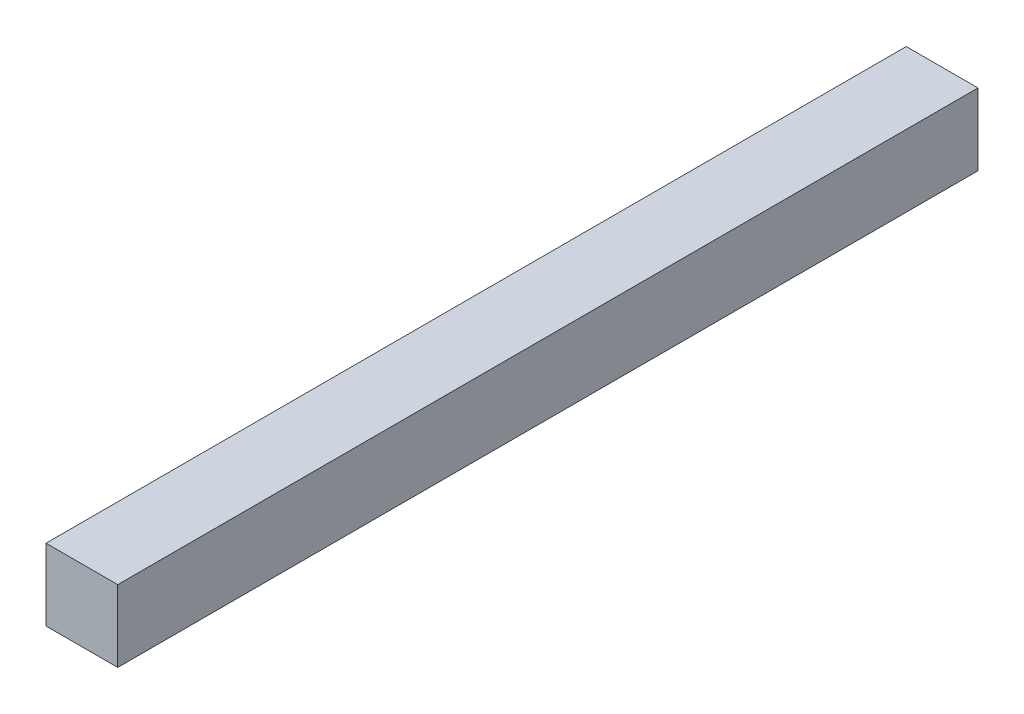
ISO-10303-21;
HEADER;
FILE_DESCRIPTION(('STEP AP214'),'2;1');
FILE_NAME('part.step','',(''),(''),'','','');
FILE_SCHEMA(('AUTOMOTIVE_DESIGN { 1 0 10303 214 1 1 1 1 }'));
ENDSEC;
DATA;
#1=APPLICATION_CONTEXT('core data for automotive mechanical design processes');
#2=APPLICATION_PROTOCOL_DEFINITION('international standard','automotive_design',2000,#1);
#3=PRODUCT_CONTEXT('',#1,'mechanical');
#4=PRODUCT('Part','Part','',(#3));
#5=PRODUCT_RELATED_PRODUCT_CATEGORY('part','',(#4));
#6=PRODUCT_DEFINITION_FORMATION('','',#4);
#7=PRODUCT_DEFINITION_CONTEXT('part definition',#1,'design');
#8=PRODUCT_DEFINITION('design','',#6,#7);
#9=PRODUCT_DEFINITION_SHAPE('','',#8);
#10=(LENGTH_UNIT() NAMED_UNIT(*) SI_UNIT(.MILLI.,.METRE.));
#11=(NAMED_UNIT(*) PLANE_ANGLE_UNIT() SI_UNIT($,.RADIAN.));
#12=(NAMED_UNIT(*) SI_UNIT($,.STERADIAN.) SOLID_ANGLE_UNIT());
#13=UNCERTAINTY_MEASURE_WITH_UNIT(LENGTH_MEASURE(1.E-05),#10,'distance_accuracy_value','');
#14=(GEOMETRIC_REPRESENTATION_CONTEXT(3) GLOBAL_UNCERTAINTY_ASSIGNED_CONTEXT((#13)) GLOBAL_UNIT_ASSIGNED_CONTEXT((#10,
#11,#12)) REPRESENTATION_CONTEXT('',''));
#15=CARTESIAN_POINT('',(0.,0.,0.));
#16=DIRECTION('',(0.,0.,1.));
#17=DIRECTION('',(1.,0.,0.));
#18=AXIS2_PLACEMENT_3D('',#15,#16,#17);
#19=CARTESIAN_POINT('',(0.,0.,38.0746));
#20=DIRECTION('',(1.,0.,0.));
#21=DIRECTION('',(0.,0.,-1.));
#22=AXIS2_PLACEMENT_3D('',#19,#20,#21);
#23=PLANE('',#22);
#24=DIRECTION('',(0.,-1.,0.));
#25=VECTOR('',#24,1.);
#26=CARTESIAN_POINT('',(0.,0.,0.));
#27=LINE('',#26,#25);
#28=CARTESIAN_POINT('',(0.,3.175,0.));
#29=VERTEX_POINT('',#28);
#30=CARTESIAN_POINT('',(0.,0.,0.));
#31=VERTEX_POINT('',#30);
#32=EDGE_CURVE('E95',#29,#31,#27,.T.);
#33=ORIENTED_EDGE('',*,*,#32,.T.);
#34=DIRECTION('',(0.,0.,-1.));
#35=VECTOR('',#34,1.);
#36=CARTESIAN_POINT('',(0.,0.,38.0746));
#37=LINE('',#36,#35);
#38=CARTESIAN_POINT('',(0.,0.,38.0746));
#39=VERTEX_POINT('',#38);
#40=EDGE_CURVE('E11',#39,#31,#37,.T.);
#41=ORIENTED_EDGE('',*,*,#40,.F.);
#42=DIRECTION('',(0.,-1.,0.));
#43=VECTOR('',#42,1.);
#44=CARTESIAN_POINT('',(0.,0.,38.0746));
#45=LINE('',#44,#43);
#46=CARTESIAN_POINT('',(0.,3.175,38.0746));
#47=VERTEX_POINT('',#46);
#48=EDGE_CURVE('E83',#47,#39,#45,.T.);
#49=ORIENTED_EDGE('',*,*,#48,.F.);
#50=DIRECTION('',(0.,0.,-1.));
#51=VECTOR('',#50,1.);
#52=CARTESIAN_POINT('',(0.,3.175,38.0746));
#53=LINE('',#52,#51);
#54=EDGE_CURVE('E91',#47,#29,#53,.T.);
#55=ORIENTED_EDGE('',*,*,#54,.T.);
#56=EDGE_LOOP('',(#33,#41,#49,#55));
#57=FACE_BOUND('',#56,.T.);
#58=ADVANCED_FACE('F32',(#57),#23,.F.);
#59=CARTESIAN_POINT('',(0.,0.,38.0746));
#60=DIRECTION('',(0.,1.,0.));
#61=DIRECTION('',(0.,0.,1.));
#62=AXIS2_PLACEMENT_3D('',#59,#60,#61);
#63=PLANE('',#62);
#64=DIRECTION('',(1.,0.,0.));
#65=VECTOR('',#64,1.);
#66=CARTESIAN_POINT('',(0.,0.,0.));
#67=LINE('',#66,#65);
#68=CARTESIAN_POINT('',(3.175,0.,0.));
#69=VERTEX_POINT('',#68);
#70=EDGE_CURVE('E87',#31,#69,#67,.T.);
#71=ORIENTED_EDGE('',*,*,#70,.T.);
#72=DIRECTION('',(0.,0.,-1.));
#73=VECTOR('',#72,1.);
#74=CARTESIAN_POINT('',(3.175,0.,38.0746));
#75=LINE('',#74,#73);
#76=CARTESIAN_POINT('',(3.175,0.,38.0746));
#77=VERTEX_POINT('',#76);
#78=EDGE_CURVE('E40',#77,#69,#75,.T.);
#79=ORIENTED_EDGE('',*,*,#78,.F.);
#80=DIRECTION('',(1.,0.,0.));
#81=VECTOR('',#80,1.);
#82=CARTESIAN_POINT('',(0.,0.,38.0746));
#83=LINE('',#82,#81);
#84=EDGE_CURVE('E78',#39,#77,#83,.T.);
#85=ORIENTED_EDGE('',*,*,#84,.F.);
#86=ORIENTED_EDGE('',*,*,#40,.T.);
#87=EDGE_LOOP('',(#71,#79,#85,#86));
#88=FACE_BOUND('',#87,.T.);
#89=ADVANCED_FACE('F86',(#88),#63,.F.);
#90=CARTESIAN_POINT('',(3.175,0.,38.0746));
#91=DIRECTION('',(-1.,0.,0.));
#92=DIRECTION('',(0.,-1.,0.));
#93=AXIS2_PLACEMENT_3D('',#90,#91,#92);
#94=PLANE('',#93);
#95=DIRECTION('',(0.,1.,0.));
#96=VECTOR('',#95,1.);
#97=CARTESIAN_POINT('',(3.175,0.,0.));
#98=LINE('',#97,#96);
#99=CARTESIAN_POINT('',(3.175,3.175,0.));
#100=VERTEX_POINT('',#99);
#101=EDGE_CURVE('E65',#69,#100,#98,.T.);
#102=ORIENTED_EDGE('',*,*,#101,.T.);
#103=DIRECTION('',(0.,0.,-1.));
#104=VECTOR('',#103,1.);
#105=CARTESIAN_POINT('',(3.175,3.175,38.0746));
#106=LINE('',#105,#104);
#107=CARTESIAN_POINT('',(3.175,3.175,38.0746));
#108=VERTEX_POINT('',#107);
#109=EDGE_CURVE('E88',#108,#100,#106,.T.);
#110=ORIENTED_EDGE('',*,*,#109,.F.);
#111=DIRECTION('',(0.,1.,0.));
#112=VECTOR('',#111,1.);
#113=CARTESIAN_POINT('',(3.175,0.,38.0746));
#114=LINE('',#113,#112);
#115=EDGE_CURVE('E81',#77,#108,#114,.T.);
#116=ORIENTED_EDGE('',*,*,#115,.F.);
#117=ORIENTED_EDGE('',*,*,#78,.T.);
#118=EDGE_LOOP('',(#102,#110,#116,#117));
#119=FACE_BOUND('',#118,.T.);
#120=ADVANCED_FACE('F89',(#119),#94,.F.);
#121=CARTESIAN_POINT('',(0.,3.175,38.0746));
#122=DIRECTION('',(0.,-1.,0.));
#123=DIRECTION('',(0.,0.,-1.));
#124=AXIS2_PLACEMENT_3D('',#121,#122,#123);
#125=PLANE('',#124);
#126=DIRECTION('',(-1.,0.,0.));
#127=VECTOR('',#126,1.);
#128=CARTESIAN_POINT('',(0.,3.175,0.));
#129=LINE('',#128,#127);
#130=EDGE_CURVE('E71',#100,#29,#129,.T.);
#131=ORIENTED_EDGE('',*,*,#130,.T.);
#132=ORIENTED_EDGE('',*,*,#54,.F.);
#133=DIRECTION('',(-1.,0.,0.));
#134=VECTOR('',#133,1.);
#135=CARTESIAN_POINT('',(0.,3.175,38.0746));
#136=LINE('',#135,#134);
#137=EDGE_CURVE('E48',#108,#47,#136,.T.);
#138=ORIENTED_EDGE('',*,*,#137,.F.);
#139=ORIENTED_EDGE('',*,*,#109,.T.);
#140=EDGE_LOOP('',(#131,#132,#138,#139));
#141=FACE_BOUND('',#140,.T.);
#142=ADVANCED_FACE('F102',(#141),#125,.F.);
#143=CARTESIAN_POINT('',(0.,0.,38.0746));
#144=DIRECTION('',(0.,0.,-1.));
#145=DIRECTION('',(-1.,0.,0.));
#146=AXIS2_PLACEMENT_3D('',#143,#144,#145);
#147=PLANE('',#146);
#148=ORIENTED_EDGE('',*,*,#48,.T.);
#149=ORIENTED_EDGE('',*,*,#84,.T.);
#150=ORIENTED_EDGE('',*,*,#115,.T.);
#151=ORIENTED_EDGE('',*,*,#137,.T.);
#152=EDGE_LOOP('',(#148,#149,#150,#151));
#153=FACE_BOUND('',#152,.T.);
#154=ADVANCED_FACE('F79',(#153),#147,.F.);
#155=CARTESIAN_POINT('',(0.,0.,0.));
#156=DIRECTION('',(0.,0.,-1.));
#157=DIRECTION('',(-1.,0.,0.));
#158=AXIS2_PLACEMENT_3D('',#155,#156,#157);
#159=PLANE('',#158);
#160=ORIENTED_EDGE('',*,*,#32,.F.);
#161=ORIENTED_EDGE('',*,*,#130,.F.);
#162=ORIENTED_EDGE('',*,*,#101,.F.);
#163=ORIENTED_EDGE('',*,*,#70,.F.);
#164=EDGE_LOOP('',(#160,#161,#162,#163));
#165=FACE_BOUND('',#164,.T.);
#166=ADVANCED_FACE('F105',(#165),#159,.T.);
#167=CLOSED_SHELL('',(#58,#89,#120,#142,#154,#166));
#168=MANIFOLD_SOLID_BREP('B2',#167);
#169=ADVANCED_BREP_SHAPE_REPRESENTATION('',(#18,#168),#14);
#170=SHAPE_DEFINITION_REPRESENTATION(#9,#169);
ENDSEC;
END-ISO-10303-21;
